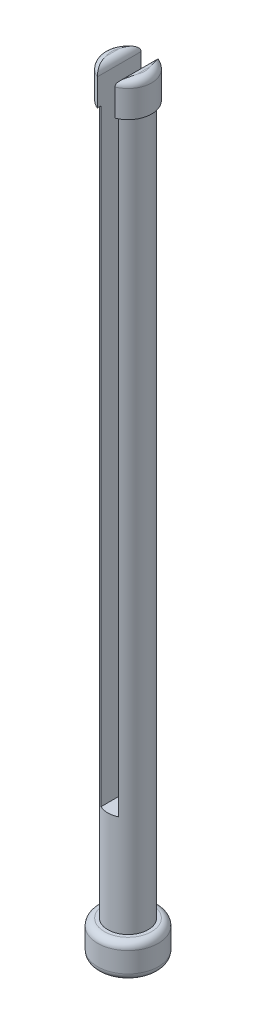
ISO-10303-21;
HEADER;
FILE_DESCRIPTION(('STEP AP214'),'2;1');
FILE_NAME('part.step','',(''),(''),'','','');
FILE_SCHEMA(('AUTOMOTIVE_DESIGN { 1 0 10303 214 1 1 1 1 }'));
ENDSEC;
DATA;
#1=APPLICATION_CONTEXT('core data for automotive mechanical design processes');
#2=APPLICATION_PROTOCOL_DEFINITION('international standard','automotive_design',2000,#1);
#3=PRODUCT_CONTEXT('',#1,'mechanical');
#4=PRODUCT('Part','Part','',(#3));
#5=PRODUCT_RELATED_PRODUCT_CATEGORY('part','',(#4));
#6=PRODUCT_DEFINITION_FORMATION('','',#4);
#7=PRODUCT_DEFINITION_CONTEXT('part definition',#1,'design');
#8=PRODUCT_DEFINITION('design','',#6,#7);
#9=PRODUCT_DEFINITION_SHAPE('','',#8);
#10=(LENGTH_UNIT() NAMED_UNIT(*) SI_UNIT(.MILLI.,.METRE.));
#11=(NAMED_UNIT(*) PLANE_ANGLE_UNIT() SI_UNIT($,.RADIAN.));
#12=(NAMED_UNIT(*) SI_UNIT($,.STERADIAN.) SOLID_ANGLE_UNIT());
#13=UNCERTAINTY_MEASURE_WITH_UNIT(LENGTH_MEASURE(1.E-05),#10,'distance_accuracy_value','');
#14=(GEOMETRIC_REPRESENTATION_CONTEXT(3) GLOBAL_UNCERTAINTY_ASSIGNED_CONTEXT((#13)) GLOBAL_UNIT_ASSIGNED_CONTEXT((#10,
#11,#12)) REPRESENTATION_CONTEXT('',''));
#15=CARTESIAN_POINT('',(0.,0.,0.));
#16=DIRECTION('',(0.,0.,1.));
#17=DIRECTION('',(1.,0.,0.));
#18=AXIS2_PLACEMENT_3D('',#15,#16,#17);
#19=CARTESIAN_POINT('',(0.,105.,0.));
#20=DIRECTION('',(0.,1.,0.));
#21=DIRECTION('',(0.,0.,1.));
#22=AXIS2_PLACEMENT_3D('',#19,#20,#21);
#23=CYLINDRICAL_SURFACE('',#22,3.5);
#24=DIRECTION('',(0.,1.,0.));
#25=VECTOR('',#24,1.);
#26=CARTESIAN_POINT('',(1.3,15.,-3.24961536185438));
#27=LINE('',#26,#25);
#28=CARTESIAN_POINT('',(1.3,105.,-3.24961536185438));
#29=VERTEX_POINT('',#28);
#30=CARTESIAN_POINT('',(1.3,109.,-3.24961536185438));
#31=VERTEX_POINT('',#30);
#32=EDGE_CURVE('E449',#29,#31,#27,.T.);
#33=ORIENTED_EDGE('',*,*,#32,.T.);
#34=CARTESIAN_POINT('',(0.,109.,0.));
#35=DIRECTION('',(0.,1.,0.));
#36=DIRECTION('',(0.,0.,1.));
#37=AXIS2_PLACEMENT_3D('',#34,#35,#36);
#38=CIRCLE('',#37,3.5);
#39=CARTESIAN_POINT('',(1.3,109.,3.24961536185438));
#40=VERTEX_POINT('',#39);
#41=EDGE_CURVE('E180',#31,#40,#38,.F.);
#42=ORIENTED_EDGE('',*,*,#41,.T.);
#43=DIRECTION('',(0.,1.,0.));
#44=VECTOR('',#43,1.);
#45=CARTESIAN_POINT('',(1.3,15.,3.24961536185438));
#46=LINE('',#45,#44);
#47=CARTESIAN_POINT('',(1.3,105.,3.24961536185438));
#48=VERTEX_POINT('',#47);
#49=EDGE_CURVE('E447',#48,#40,#46,.T.);
#50=ORIENTED_EDGE('',*,*,#49,.F.);
#51=CARTESIAN_POINT('',(0.,105.,0.));
#52=DIRECTION('',(0.,1.,0.));
#53=DIRECTION('',(0.,0.,1.));
#54=AXIS2_PLACEMENT_3D('',#51,#52,#53);
#55=CIRCLE('',#54,3.5);
#56=EDGE_CURVE('E144',#48,#29,#55,.T.);
#57=ORIENTED_EDGE('',*,*,#56,.T.);
#58=EDGE_LOOP('',(#33,#42,#50,#57));
#59=FACE_BOUND('',#58,.T.);
#60=ADVANCED_FACE('F39',(#59),#23,.T.);
#61=CARTESIAN_POINT('',(0.,105.,0.));
#62=DIRECTION('',(0.,1.,0.));
#63=DIRECTION('',(0.,0.,1.));
#64=AXIS2_PLACEMENT_3D('',#61,#62,#63);
#65=PLANE('',#64);
#66=ORIENTED_EDGE('',*,*,#56,.F.);
#67=DIRECTION('',(0.,0.,-1.));
#68=VECTOR('',#67,1.);
#69=CARTESIAN_POINT('',(1.3,105.,0.));
#70=LINE('',#69,#68);
#71=CARTESIAN_POINT('',(1.3,105.,2.70370116691916));
#72=VERTEX_POINT('',#71);
#73=EDGE_CURVE('E150',#48,#72,#70,.T.);
#74=ORIENTED_EDGE('',*,*,#73,.T.);
#75=CARTESIAN_POINT('',(0.,105.,0.));
#76=DIRECTION('',(0.,1.,0.));
#77=DIRECTION('',(0.,0.,1.));
#78=AXIS2_PLACEMENT_3D('',#75,#76,#77);
#79=CIRCLE('',#78,3.);
#80=CARTESIAN_POINT('',(1.3,105.,-2.70370116691916));
#81=VERTEX_POINT('',#80);
#82=EDGE_CURVE('E169',#72,#81,#79,.T.);
#83=ORIENTED_EDGE('',*,*,#82,.T.);
#84=EDGE_CURVE('E459',#81,#29,#70,.T.);
#85=ORIENTED_EDGE('',*,*,#84,.T.);
#86=EDGE_LOOP('',(#66,#74,#83,#85));
#87=FACE_BOUND('',#86,.T.);
#88=ADVANCED_FACE('F238',(#87),#65,.F.);
#89=CARTESIAN_POINT('',(0.,110.,0.));
#90=DIRECTION('',(0.,1.,0.));
#91=DIRECTION('',(0.,0.,1.));
#92=AXIS2_PLACEMENT_3D('',#89,#90,#91);
#93=PLANE('',#92);
#94=DIRECTION('',(0.,0.,-1.));
#95=VECTOR('',#94,1.);
#96=CARTESIAN_POINT('',(2.3,110.,3.24961536185438));
#97=LINE('',#96,#95);
#98=CARTESIAN_POINT('',(2.3,110.,-0.979795897113272));
#99=VERTEX_POINT('',#98);
#100=CARTESIAN_POINT('',(2.3,110.,0.979795897113272));
#101=VERTEX_POINT('',#100);
#102=EDGE_CURVE('E175',#99,#101,#97,.F.);
#103=ORIENTED_EDGE('',*,*,#102,.T.);
#104=CARTESIAN_POINT('',(0.,110.,0.));
#105=DIRECTION('',(0.,1.,0.));
#106=DIRECTION('',(0.,0.,1.));
#107=AXIS2_PLACEMENT_3D('',#104,#105,#106);
#108=CIRCLE('',#107,2.5);
#109=EDGE_CURVE('E177',#101,#99,#108,.T.);
#110=ORIENTED_EDGE('',*,*,#109,.T.);
#111=EDGE_LOOP('',(#103,#110));
#112=FACE_BOUND('',#111,.T.);
#113=ADVANCED_FACE('F229',(#112),#93,.T.);
#114=CARTESIAN_POINT('',(0.,110.,0.));
#115=DIRECTION('',(0.,-1.,0.));
#116=DIRECTION('',(0.,0.,-1.));
#117=AXIS2_PLACEMENT_3D('',#114,#115,#116);
#118=CYLINDRICAL_SURFACE('',#117,3.);
#119=CARTESIAN_POINT('',(0.,15.,0.));
#120=DIRECTION('',(0.,1.,0.));
#121=DIRECTION('',(0.,0.,1.));
#122=AXIS2_PLACEMENT_3D('',#119,#120,#121);
#123=CIRCLE('',#122,3.);
#124=CARTESIAN_POINT('',(1.3,15.,-2.70370116691916));
#125=VERTEX_POINT('',#124);
#126=CARTESIAN_POINT('',(-1.3,15.,-2.70370116691916));
#127=VERTEX_POINT('',#126);
#128=EDGE_CURVE('E174',#125,#127,#123,.T.);
#129=ORIENTED_EDGE('',*,*,#128,.F.);
#130=DIRECTION('',(0.,-1.,0.));
#131=VECTOR('',#130,1.);
#132=CARTESIAN_POINT('',(1.3,110.,-2.70370116691916));
#133=LINE('',#132,#131);
#134=EDGE_CURVE('E461',#125,#81,#133,.F.);
#135=ORIENTED_EDGE('',*,*,#134,.T.);
#136=ORIENTED_EDGE('',*,*,#82,.F.);
#137=DIRECTION('',(0.,-1.,0.));
#138=VECTOR('',#137,1.);
#139=CARTESIAN_POINT('',(1.3,110.,2.70370116691916));
#140=LINE('',#139,#138);
#141=CARTESIAN_POINT('',(1.3,15.,2.70370116691916));
#142=VERTEX_POINT('',#141);
#143=EDGE_CURVE('E145',#72,#142,#140,.T.);
#144=ORIENTED_EDGE('',*,*,#143,.T.);
#145=CARTESIAN_POINT('',(-1.3,15.,2.70370116691916));
#146=VERTEX_POINT('',#145);
#147=EDGE_CURVE('E172',#146,#142,#123,.T.);
#148=ORIENTED_EDGE('',*,*,#147,.F.);
#149=DIRECTION('',(0.,-1.,0.));
#150=VECTOR('',#149,1.);
#151=CARTESIAN_POINT('',(-1.3,110.,2.70370116691916));
#152=LINE('',#151,#150);
#153=CARTESIAN_POINT('',(-1.3,105.,2.70370116691916));
#154=VERTEX_POINT('',#153);
#155=EDGE_CURVE('E131',#146,#154,#152,.F.);
#156=ORIENTED_EDGE('',*,*,#155,.T.);
#157=CARTESIAN_POINT('',(-1.3,105.,-2.70370116691916));
#158=VERTEX_POINT('',#157);
#159=EDGE_CURVE('E168',#158,#154,#79,.T.);
#160=ORIENTED_EDGE('',*,*,#159,.F.);
#161=DIRECTION('',(0.,-1.,0.));
#162=VECTOR('',#161,1.);
#163=CARTESIAN_POINT('',(-1.3,110.,-2.70370116691916));
#164=LINE('',#163,#162);
#165=EDGE_CURVE('E126',#158,#127,#164,.T.);
#166=ORIENTED_EDGE('',*,*,#165,.T.);
#167=EDGE_LOOP('',(#129,#135,#136,#144,#148,#156,#160,#166));
#168=FACE_BOUND('',#167,.T.);
#169=CARTESIAN_POINT('',(0.,0.,0.));
#170=DIRECTION('',(0.,1.,0.));
#171=DIRECTION('',(0.,0.,1.));
#172=AXIS2_PLACEMENT_3D('',#169,#170,#171);
#173=CIRCLE('',#172,3.);
#174=CARTESIAN_POINT('',(0.,0.,3.));
#175=VERTEX_POINT('',#174);
#176=EDGE_CURVE('E148',#175,#175,#173,.T.);
#177=ORIENTED_EDGE('',*,*,#176,.T.);
#178=EDGE_LOOP('',(#177));
#179=FACE_BOUND('',#178,.T.);
#180=ADVANCED_FACE('F242',(#168,#179),#118,.T.);
#181=CARTESIAN_POINT('',(0.,-5.,0.));
#182=DIRECTION('',(0.,1.,0.));
#183=DIRECTION('',(0.,0.,1.));
#184=AXIS2_PLACEMENT_3D('',#181,#182,#183);
#185=CYLINDRICAL_SURFACE('',#184,4.5);
#186=CARTESIAN_POINT('',(0.,-1.,0.));
#187=DIRECTION('',(0.,-1.,0.));
#188=DIRECTION('',(0.,0.,-1.));
#189=AXIS2_PLACEMENT_3D('',#186,#187,#188);
#190=CIRCLE('',#189,4.5);
#191=CARTESIAN_POINT('',(0.,-1.,-4.5));
#192=VERTEX_POINT('',#191);
#193=EDGE_CURVE('E159',#192,#192,#190,.T.);
#194=ORIENTED_EDGE('',*,*,#193,.T.);
#195=EDGE_LOOP('',(#194));
#196=FACE_BOUND('',#195,.T.);
#197=CARTESIAN_POINT('',(0.,-4.,0.));
#198=DIRECTION('',(0.,-1.,0.));
#199=DIRECTION('',(0.,0.,-1.));
#200=AXIS2_PLACEMENT_3D('',#197,#198,#199);
#201=CIRCLE('',#200,4.5);
#202=CARTESIAN_POINT('',(0.,-4.,-4.5));
#203=VERTEX_POINT('',#202);
#204=EDGE_CURVE('E156',#203,#203,#201,.F.);
#205=ORIENTED_EDGE('',*,*,#204,.T.);
#206=EDGE_LOOP('',(#205));
#207=FACE_BOUND('',#206,.T.);
#208=ADVANCED_FACE('F269',(#196,#207),#185,.T.);
#209=CARTESIAN_POINT('',(0.,-5.,0.));
#210=DIRECTION('',(0.,-1.,0.));
#211=DIRECTION('',(0.,0.,-1.));
#212=AXIS2_PLACEMENT_3D('',#209,#210,#211);
#213=PLANE('',#212);
#214=CARTESIAN_POINT('',(0.,-5.,0.));
#215=DIRECTION('',(0.,-1.,0.));
#216=DIRECTION('',(0.,0.,-1.));
#217=AXIS2_PLACEMENT_3D('',#214,#215,#216);
#218=CIRCLE('',#217,3.5);
#219=CARTESIAN_POINT('',(0.,-5.,-3.5));
#220=VERTEX_POINT('',#219);
#221=EDGE_CURVE('E165',#220,#220,#218,.T.);
#222=ORIENTED_EDGE('',*,*,#221,.T.);
#223=EDGE_LOOP('',(#222));
#224=FACE_BOUND('',#223,.T.);
#225=ADVANCED_FACE('F274',(#224),#213,.T.);
#226=CARTESIAN_POINT('',(0.,0.,0.));
#227=DIRECTION('',(0.,-1.,0.));
#228=DIRECTION('',(0.,0.,-1.));
#229=AXIS2_PLACEMENT_3D('',#226,#227,#228);
#230=PLANE('',#229);
#231=CARTESIAN_POINT('',(0.,0.,0.));
#232=DIRECTION('',(0.,-1.,0.));
#233=DIRECTION('',(0.,0.,-1.));
#234=AXIS2_PLACEMENT_3D('',#231,#232,#233);
#235=CIRCLE('',#234,3.5);
#236=CARTESIAN_POINT('',(0.,0.,-3.5));
#237=VERTEX_POINT('',#236);
#238=EDGE_CURVE('E162',#237,#237,#235,.F.);
#239=ORIENTED_EDGE('',*,*,#238,.T.);
#240=EDGE_LOOP('',(#239));
#241=FACE_BOUND('',#240,.T.);
#242=ORIENTED_EDGE('',*,*,#176,.F.);
#243=EDGE_LOOP('',(#242));
#244=FACE_BOUND('',#243,.T.);
#245=ADVANCED_FACE('F263',(#241,#244),#230,.F.);
#246=CARTESIAN_POINT('',(0.,-1.,0.));
#247=DIRECTION('',(0.,-1.,0.));
#248=DIRECTION('',(0.,0.,-1.));
#249=AXIS2_PLACEMENT_3D('',#246,#247,#248);
#250=TOROIDAL_SURFACE('',#249,3.5,1.);
#251=ORIENTED_EDGE('',*,*,#238,.F.);
#252=EDGE_LOOP('',(#251));
#253=FACE_BOUND('',#252,.T.);
#254=ORIENTED_EDGE('',*,*,#193,.F.);
#255=EDGE_LOOP('',(#254));
#256=FACE_BOUND('',#255,.T.);
#257=ADVANCED_FACE('F258',(#253,#256),#250,.T.);
#258=CARTESIAN_POINT('',(0.,-4.,0.));
#259=DIRECTION('',(0.,-1.,0.));
#260=DIRECTION('',(0.,0.,-1.));
#261=AXIS2_PLACEMENT_3D('',#258,#259,#260);
#262=TOROIDAL_SURFACE('',#261,3.5,1.);
#263=ORIENTED_EDGE('',*,*,#204,.F.);
#264=EDGE_LOOP('',(#263));
#265=FACE_BOUND('',#264,.T.);
#266=ORIENTED_EDGE('',*,*,#221,.F.);
#267=EDGE_LOOP('',(#266));
#268=FACE_BOUND('',#267,.T.);
#269=ADVANCED_FACE('F254',(#265,#268),#262,.T.);
#270=DIRECTION('',(0.,1.,0.));
#271=VECTOR('',#270,1.);
#272=CARTESIAN_POINT('',(-1.3,15.,3.24961536185438));
#273=LINE('',#272,#271);
#274=CARTESIAN_POINT('',(-1.3,105.,3.24961536185438));
#275=VERTEX_POINT('',#274);
#276=CARTESIAN_POINT('',(-1.3,109.,3.24961536185438));
#277=VERTEX_POINT('',#276);
#278=EDGE_CURVE('E139',#275,#277,#273,.T.);
#279=ORIENTED_EDGE('',*,*,#278,.T.);
#280=CARTESIAN_POINT('',(0.,109.,0.));
#281=DIRECTION('',(0.,1.,0.));
#282=DIRECTION('',(0.,0.,1.));
#283=AXIS2_PLACEMENT_3D('',#280,#281,#282);
#284=CIRCLE('',#283,3.5);
#285=CARTESIAN_POINT('',(-1.3,109.,-3.24961536185439));
#286=VERTEX_POINT('',#285);
#287=EDGE_CURVE('E53',#277,#286,#284,.F.);
#288=ORIENTED_EDGE('',*,*,#287,.T.);
#289=DIRECTION('',(0.,1.,0.));
#290=VECTOR('',#289,1.);
#291=CARTESIAN_POINT('',(-1.3,15.,-3.24961536185439));
#292=LINE('',#291,#290);
#293=CARTESIAN_POINT('',(-1.3,105.,-3.24961536185439));
#294=VERTEX_POINT('',#293);
#295=EDGE_CURVE('E123',#294,#286,#292,.T.);
#296=ORIENTED_EDGE('',*,*,#295,.F.);
#297=EDGE_CURVE('E138',#294,#275,#55,.T.);
#298=ORIENTED_EDGE('',*,*,#297,.T.);
#299=EDGE_LOOP('',(#279,#288,#296,#298));
#300=FACE_BOUND('',#299,.T.);
#301=ADVANCED_FACE('F137',(#300),#23,.T.);
#302=ORIENTED_EDGE('',*,*,#297,.F.);
#303=DIRECTION('',(0.,0.,1.));
#304=VECTOR('',#303,1.);
#305=CARTESIAN_POINT('',(-1.3,105.,0.));
#306=LINE('',#305,#304);
#307=EDGE_CURVE('E120',#294,#158,#306,.T.);
#308=ORIENTED_EDGE('',*,*,#307,.T.);
#309=ORIENTED_EDGE('',*,*,#159,.T.);
#310=EDGE_CURVE('E133',#154,#275,#306,.T.);
#311=ORIENTED_EDGE('',*,*,#310,.T.);
#312=EDGE_LOOP('',(#302,#308,#309,#311));
#313=FACE_BOUND('',#312,.T.);
#314=ADVANCED_FACE('F143',(#313),#65,.F.);
#315=DIRECTION('',(0.,0.,1.));
#316=VECTOR('',#315,1.);
#317=CARTESIAN_POINT('',(-2.3,110.,-3.24961536185439));
#318=LINE('',#317,#316);
#319=CARTESIAN_POINT('',(-2.3,110.,0.979795897113274));
#320=VERTEX_POINT('',#319);
#321=CARTESIAN_POINT('',(-2.3,110.,-0.979795897113274));
#322=VERTEX_POINT('',#321);
#323=EDGE_CURVE('E185',#320,#322,#318,.F.);
#324=ORIENTED_EDGE('',*,*,#323,.T.);
#325=CARTESIAN_POINT('',(0.,110.,0.));
#326=DIRECTION('',(0.,1.,0.));
#327=DIRECTION('',(0.,0.,1.));
#328=AXIS2_PLACEMENT_3D('',#325,#326,#327);
#329=CIRCLE('',#328,2.5);
#330=EDGE_CURVE('E187',#322,#320,#329,.T.);
#331=ORIENTED_EDGE('',*,*,#330,.T.);
#332=EDGE_LOOP('',(#324,#331));
#333=FACE_BOUND('',#332,.T.);
#334=ADVANCED_FACE('F225',(#333),#93,.T.);
#335=CARTESIAN_POINT('',(0.,15.,0.));
#336=DIRECTION('',(0.,1.,0.));
#337=DIRECTION('',(0.,0.,1.));
#338=AXIS2_PLACEMENT_3D('',#335,#336,#337);
#339=PLANE('',#338);
#340=ORIENTED_EDGE('',*,*,#128,.T.);
#341=DIRECTION('',(0.,0.,1.));
#342=VECTOR('',#341,1.);
#343=CARTESIAN_POINT('',(-1.3,15.,-3.24961536185439));
#344=LINE('',#343,#342);
#345=EDGE_CURVE('E444',#127,#146,#344,.T.);
#346=ORIENTED_EDGE('',*,*,#345,.T.);
#347=ORIENTED_EDGE('',*,*,#147,.T.);
#348=DIRECTION('',(0.,0.,-1.));
#349=VECTOR('',#348,1.);
#350=CARTESIAN_POINT('',(1.3,15.,-3.24961536185438));
#351=LINE('',#350,#349);
#352=EDGE_CURVE('E140',#142,#125,#351,.T.);
#353=ORIENTED_EDGE('',*,*,#352,.T.);
#354=EDGE_LOOP('',(#340,#346,#347,#353));
#355=FACE_BOUND('',#354,.T.);
#356=ADVANCED_FACE('F227',(#355),#339,.T.);
#357=CARTESIAN_POINT('',(1.3,15.,-3.24961536185438));
#358=DIRECTION('',(1.,0.,0.));
#359=DIRECTION('',(0.,0.,-1.));
#360=AXIS2_PLACEMENT_3D('',#357,#358,#359);
#361=PLANE('',#360);
#362=ORIENTED_EDGE('',*,*,#49,.T.);
#363=DIRECTION('',(0.,0.,-1.));
#364=VECTOR('',#363,1.);
#365=CARTESIAN_POINT('',(1.3,109.,-3.24961536185438));
#366=LINE('',#365,#364);
#367=EDGE_CURVE('E183',#40,#31,#366,.T.);
#368=ORIENTED_EDGE('',*,*,#367,.T.);
#369=ORIENTED_EDGE('',*,*,#32,.F.);
#370=ORIENTED_EDGE('',*,*,#84,.F.);
#371=ORIENTED_EDGE('',*,*,#134,.F.);
#372=ORIENTED_EDGE('',*,*,#352,.F.);
#373=ORIENTED_EDGE('',*,*,#143,.F.);
#374=ORIENTED_EDGE('',*,*,#73,.F.);
#375=EDGE_LOOP('',(#362,#368,#369,#370,#371,#372,#373,#374));
#376=FACE_BOUND('',#375,.T.);
#377=ADVANCED_FACE('F234',(#376),#361,.F.);
#378=CARTESIAN_POINT('',(-1.3,15.,-3.24961536185439));
#379=DIRECTION('',(-1.,0.,0.));
#380=DIRECTION('',(0.,0.,1.));
#381=AXIS2_PLACEMENT_3D('',#378,#379,#380);
#382=PLANE('',#381);
#383=ORIENTED_EDGE('',*,*,#295,.T.);
#384=DIRECTION('',(0.,0.,1.));
#385=VECTOR('',#384,1.);
#386=CARTESIAN_POINT('',(-1.3,109.,3.24961536185439));
#387=LINE('',#386,#385);
#388=EDGE_CURVE('E11',#286,#277,#387,.T.);
#389=ORIENTED_EDGE('',*,*,#388,.T.);
#390=ORIENTED_EDGE('',*,*,#278,.F.);
#391=ORIENTED_EDGE('',*,*,#310,.F.);
#392=ORIENTED_EDGE('',*,*,#155,.F.);
#393=ORIENTED_EDGE('',*,*,#345,.F.);
#394=ORIENTED_EDGE('',*,*,#165,.F.);
#395=ORIENTED_EDGE('',*,*,#307,.F.);
#396=EDGE_LOOP('',(#383,#389,#390,#391,#392,#393,#394,#395));
#397=FACE_BOUND('',#396,.T.);
#398=ADVANCED_FACE('F122',(#397),#382,.F.);
#399=CARTESIAN_POINT('',(2.3,109.,-3.24961536185438));
#400=DIRECTION('',(0.,0.,1.));
#401=DIRECTION('',(1.,0.,0.));
#402=AXIS2_PLACEMENT_3D('',#399,#400,#401);
#403=CYLINDRICAL_SURFACE('',#402,1.);
#404=CARTESIAN_POINT('',(1.3,109.,-3.24961536185438));
#405=CARTESIAN_POINT('',(1.29999617948563,109.019474030543,-3.24961990449372));
#406=CARTESIAN_POINT('',(1.30056944602511,109.038933366426,-3.24877431368444));
#407=CARTESIAN_POINT('',(1.30282966735056,109.077620927511,-3.24543364635595));
#408=CARTESIAN_POINT('',(1.30451523516631,109.096849410208,-3.24294062407548));
#409=CARTESIAN_POINT('',(1.31112402450608,109.153462817199,-3.23314907909252));
#410=CARTESIAN_POINT('',(1.31760166750374,109.190292415144,-3.22353506439727));
#411=CARTESIAN_POINT('',(1.33399254225991,109.261055386044,-3.19903383034988));
#412=CARTESIAN_POINT('',(1.34389013109467,109.295001084083,-3.18417061426155));
#413=CARTESIAN_POINT('',(1.36634102424429,109.359807077856,-3.15014559392438));
#414=CARTESIAN_POINT('',(1.37890288410622,109.390656950459,-3.13096992920808));
#415=CARTESIAN_POINT('',(1.41284404887768,109.46403335045,-3.07858458464715));
#416=CARTESIAN_POINT('',(1.43544332136667,109.504443601009,-3.04321841822527));
#417=CARTESIAN_POINT('',(1.48300255301403,109.578319414985,-2.9672590370184));
#418=CARTESIAN_POINT('',(1.50796734543838,109.611770293306,-2.92665505633897));
#419=CARTESIAN_POINT('',(1.55488616865933,109.667769359681,-2.84857283552067));
#420=CARTESIAN_POINT('',(1.57668669227106,109.691205460478,-2.81162626283582));
#421=CARTESIAN_POINT('',(1.62053682228423,109.734353422963,-2.73574325182172));
#422=CARTESIAN_POINT('',(1.64258659507063,109.754062619566,-2.69680541464126));
#423=CARTESIAN_POINT('',(1.70858713467808,109.808391620741,-2.5775686666515));
#424=CARTESIAN_POINT('',(1.75233561914954,109.838153794094,-2.49493454337694));
#425=CARTESIAN_POINT('',(1.82751169009361,109.882143907925,-2.34524057375441));
#426=CARTESIAN_POINT('',(1.85945489940552,109.898371211877,-2.2789811599933));
#427=CARTESIAN_POINT('',(1.92139303097132,109.926180757283,-2.14456037907195));
#428=CARTESIAN_POINT('',(1.95138696558684,109.937760659183,-2.07639807239368));
#429=CARTESIAN_POINT('',(2.00900690731399,109.957207415398,-1.93862840785605));
#430=CARTESIAN_POINT('',(2.03663430576567,109.965076463841,-1.86902192938078));
#431=CARTESIAN_POINT('',(2.08927165832763,109.977919893623,-1.72856135606967));
#432=CARTESIAN_POINT('',(2.11428134212099,109.982893976257,-1.65770713326702));
#433=CARTESIAN_POINT('',(2.15970085002571,109.990356044282,-1.52027494743875));
#434=CARTESIAN_POINT('',(2.18031466231242,109.993001854237,-1.45377244678355));
#435=CARTESIAN_POINT('',(2.21895634053019,109.996899618255,-1.32003301967953));
#436=CARTESIAN_POINT('',(2.23698606086279,109.998152576268,-1.2527966575336));
#437=CARTESIAN_POINT('',(2.26713300711006,109.999550451322,-1.13070583976032));
#438=CARTESIAN_POINT('',(2.27971954650943,109.999862672938,-1.0759688644992));
#439=CARTESIAN_POINT('',(2.29362479118003,109.999982132452,-1.01059938309482));
#440=CARTESIAN_POINT('',(2.29581362632801,109.999993558662,-1.00014926122411));
#441=CARTESIAN_POINT('',(2.29864972179388,109.99999932047,-0.986394213879184));
#442=CARTESIAN_POINT('',(2.29932649304671,110.000000001092,-0.98309539161348));
#443=CARTESIAN_POINT('',(2.3,110.,-0.979795897113272));
#444=B_SPLINE_CURVE_WITH_KNOTS('',3,(#404,#405,#406,#407,#408,#409,#410,#411,#412,#413,#414,
#415,#416,#417,#418,#419,#420,#421,#422,#423,#424,#425,#426,#427,#428,#429,#430,#431,#432,#433,
#434,#435,#436,#437,#438,#439,#440,#441,#442,#443),.UNSPECIFIED.,.F.,.F.,(4,2,2,2,2,2,2,2,2,2,2,
2,2,2,2,2,2,2,2,4),(0.,0.0583680824632132,0.1166635207535,0.231732977880348,0.346282923008827,
0.461206438101285,0.635014714293363,0.809186107646312,0.955626002674397,1.10217022313356,
1.39561102764091,1.62141461550488,1.84733173332468,2.07311510445687,2.29892176803411,
2.50787765095711,2.71668282354583,2.88514708070452,2.9171776894304,2.92728027210927),.UNSPECIFIED.);
#445=EDGE_CURVE('E191',#31,#99,#444,.T.);
#446=ORIENTED_EDGE('',*,*,#445,.F.);
#447=ORIENTED_EDGE('',*,*,#367,.F.);
#448=CARTESIAN_POINT('',(1.3,109.,3.24961536185438));
#449=CARTESIAN_POINT('',(1.29999617948563,109.019474030543,3.24961990449372));
#450=CARTESIAN_POINT('',(1.30056944602511,109.038933366426,3.24877431368444));
#451=CARTESIAN_POINT('',(1.30282966735056,109.077620927511,3.24543364635595));
#452=CARTESIAN_POINT('',(1.30451523516631,109.096849410208,3.24294062407548));
#453=CARTESIAN_POINT('',(1.31112402450608,109.153462817199,3.23314907909252));
#454=CARTESIAN_POINT('',(1.31760166750374,109.190292415144,3.22353506439727));
#455=CARTESIAN_POINT('',(1.33399254225991,109.261055386044,3.19903383034988));
#456=CARTESIAN_POINT('',(1.34389013109467,109.295001084083,3.18417061426155));
#457=CARTESIAN_POINT('',(1.36634102424429,109.359807077856,3.15014559392438));
#458=CARTESIAN_POINT('',(1.37890288410622,109.390656950459,3.13096992920808));
#459=CARTESIAN_POINT('',(1.41284404887768,109.46403335045,3.07858458464715));
#460=CARTESIAN_POINT('',(1.43544332136667,109.504443601009,3.04321841822527));
#461=CARTESIAN_POINT('',(1.48300255301403,109.578319414985,2.9672590370184));
#462=CARTESIAN_POINT('',(1.50796734543838,109.611770293306,2.92665505633897));
#463=CARTESIAN_POINT('',(1.55488616865933,109.667769359681,2.84857283552067));
#464=CARTESIAN_POINT('',(1.57668669227106,109.691205460478,2.81162626283582));
#465=CARTESIAN_POINT('',(1.62053682228423,109.734353422963,2.73574325182172));
#466=CARTESIAN_POINT('',(1.64258659507063,109.754062619566,2.69680541464126));
#467=CARTESIAN_POINT('',(1.70858713467808,109.808391620741,2.5775686666515));
#468=CARTESIAN_POINT('',(1.75233561914954,109.838153794094,2.49493454337694));
#469=CARTESIAN_POINT('',(1.82751169009361,109.882143907925,2.34524057375441));
#470=CARTESIAN_POINT('',(1.85945489940552,109.898371211877,2.2789811599933));
#471=CARTESIAN_POINT('',(1.92139303097132,109.926180757283,2.14456037907195));
#472=CARTESIAN_POINT('',(1.95138696558684,109.937760659183,2.07639807239368));
#473=CARTESIAN_POINT('',(2.00900690731399,109.957207415398,1.93862840785605));
#474=CARTESIAN_POINT('',(2.03663430576567,109.965076463841,1.86902192938078));
#475=CARTESIAN_POINT('',(2.08927165832763,109.977919893623,1.72856135606967));
#476=CARTESIAN_POINT('',(2.11428134212099,109.982893976257,1.65770713326702));
#477=CARTESIAN_POINT('',(2.15970085002571,109.990356044282,1.52027494743875));
#478=CARTESIAN_POINT('',(2.18031466231242,109.993001854237,1.45377244678355));
#479=CARTESIAN_POINT('',(2.21895634053019,109.996899618255,1.32003301967953));
#480=CARTESIAN_POINT('',(2.23698606086279,109.998152576268,1.2527966575336));
#481=CARTESIAN_POINT('',(2.26713300711006,109.999550451322,1.13070583976032));
#482=CARTESIAN_POINT('',(2.27971954650943,109.999862672938,1.0759688644992));
#483=CARTESIAN_POINT('',(2.29362479118003,109.999982132452,1.01059938309482));
#484=CARTESIAN_POINT('',(2.29581362632801,109.999993558662,1.00014926122411));
#485=CARTESIAN_POINT('',(2.29864972179388,109.99999932047,0.986394213879184));
#486=CARTESIAN_POINT('',(2.29932649304671,110.000000001092,0.98309539161348));
#487=CARTESIAN_POINT('',(2.3,110.,0.979795897113272));
#488=B_SPLINE_CURVE_WITH_KNOTS('',3,(#448,#449,#450,#451,#452,#453,#454,#455,#456,#457,#458,
#459,#460,#461,#462,#463,#464,#465,#466,#467,#468,#469,#470,#471,#472,#473,#474,#475,#476,#477,
#478,#479,#480,#481,#482,#483,#484,#485,#486,#487),.UNSPECIFIED.,.F.,.F.,(4,2,2,2,2,2,2,2,2,2,2,
2,2,2,2,2,2,2,2,4),(0.,0.0583680824632132,0.1166635207535,0.231732977880348,0.346282923008827,
0.461206438101285,0.635014714293363,0.809186107646312,0.955626002674397,1.10217022313356,
1.39561102764091,1.62141461550488,1.84733173332468,2.07311510445687,2.29892176803411,
2.50787765095711,2.71668282354583,2.88514708070452,2.9171776894304,2.92728027210927),.UNSPECIFIED.);
#489=EDGE_CURVE('E199',#101,#40,#488,.F.);
#490=ORIENTED_EDGE('',*,*,#489,.F.);
#491=ORIENTED_EDGE('',*,*,#102,.F.);
#492=EDGE_LOOP('',(#446,#447,#490,#491));
#493=FACE_BOUND('',#492,.T.);
#494=ADVANCED_FACE('F207',(#493),#403,.T.);
#495=CARTESIAN_POINT('',(0.,109.,0.));
#496=DIRECTION('',(0.,1.,0.));
#497=DIRECTION('',(0.,0.,1.));
#498=AXIS2_PLACEMENT_3D('',#495,#496,#497);
#499=TOROIDAL_SURFACE('',#498,2.5,1.);
#500=ORIENTED_EDGE('',*,*,#489,.T.);
#501=ORIENTED_EDGE('',*,*,#41,.F.);
#502=ORIENTED_EDGE('',*,*,#445,.T.);
#503=ORIENTED_EDGE('',*,*,#109,.F.);
#504=EDGE_LOOP('',(#500,#501,#502,#503));
#505=FACE_BOUND('',#504,.T.);
#506=ADVANCED_FACE('F204',(#505),#499,.T.);
#507=CARTESIAN_POINT('',(-2.3,109.,-3.24961536185439));
#508=DIRECTION('',(0.,0.,-1.));
#509=DIRECTION('',(-1.,0.,0.));
#510=AXIS2_PLACEMENT_3D('',#507,#508,#509);
#511=CYLINDRICAL_SURFACE('',#510,1.);
#512=CARTESIAN_POINT('',(-1.3,109.,3.24961536185438));
#513=CARTESIAN_POINT('',(-1.29999617948563,109.019474030543,3.24961990449372));
#514=CARTESIAN_POINT('',(-1.30056944602511,109.038933366426,3.24877431368444));
#515=CARTESIAN_POINT('',(-1.30282966735056,109.077620927511,3.24543364635595));
#516=CARTESIAN_POINT('',(-1.30451523516631,109.096849410208,3.24294062407548));
#517=CARTESIAN_POINT('',(-1.31112402450608,109.153462817199,3.23314907909252));
#518=CARTESIAN_POINT('',(-1.31760166750374,109.190292415144,3.22353506439727));
#519=CARTESIAN_POINT('',(-1.33399254225991,109.261055386044,3.19903383034988));
#520=CARTESIAN_POINT('',(-1.34389013109467,109.295001084083,3.18417061426155));
#521=CARTESIAN_POINT('',(-1.36634102424429,109.359807077856,3.15014559392438));
#522=CARTESIAN_POINT('',(-1.37890288410622,109.390656950459,3.13096992920808));
#523=CARTESIAN_POINT('',(-1.41284404887768,109.46403335045,3.07858458464715));
#524=CARTESIAN_POINT('',(-1.43544332136667,109.504443601009,3.04321841822527));
#525=CARTESIAN_POINT('',(-1.48300255301403,109.578319414985,2.9672590370184));
#526=CARTESIAN_POINT('',(-1.50796734543838,109.611770293306,2.92665505633897));
#527=CARTESIAN_POINT('',(-1.55488616865932,109.667769359681,2.84857283552067));
#528=CARTESIAN_POINT('',(-1.57668669227106,109.691205460478,2.81162626283582));
#529=CARTESIAN_POINT('',(-1.62053682228423,109.734353422963,2.73574325182172));
#530=CARTESIAN_POINT('',(-1.64258659507063,109.754062619566,2.69680541464126));
#531=CARTESIAN_POINT('',(-1.70858713467808,109.808391620741,2.5775686666515));
#532=CARTESIAN_POINT('',(-1.75233561914953,109.838153794094,2.49493454337694));
#533=CARTESIAN_POINT('',(-1.82751169009361,109.882143907925,2.34524057375442));
#534=CARTESIAN_POINT('',(-1.85945489940552,109.898371211877,2.2789811599933));
#535=CARTESIAN_POINT('',(-1.92139303097132,109.926180757283,2.14456037907196));
#536=CARTESIAN_POINT('',(-1.95138696558684,109.937760659183,2.07639807239368));
#537=CARTESIAN_POINT('',(-2.00900690731399,109.957207415398,1.93862840785605));
#538=CARTESIAN_POINT('',(-2.03663430576567,109.965076463841,1.86902192938078));
#539=CARTESIAN_POINT('',(-2.08927165832763,109.977919893623,1.72856135606967));
#540=CARTESIAN_POINT('',(-2.11428134212099,109.982893976257,1.65770713326702));
#541=CARTESIAN_POINT('',(-2.15970085002571,109.990356044282,1.52027494743875));
#542=CARTESIAN_POINT('',(-2.18031466231242,109.993001854237,1.45377244678356));
#543=CARTESIAN_POINT('',(-2.21895634053019,109.996899618255,1.32003301967953));
#544=CARTESIAN_POINT('',(-2.23698606086279,109.998152576268,1.2527966575336));
#545=CARTESIAN_POINT('',(-2.26713300711006,109.999550451322,1.13070583976032));
#546=CARTESIAN_POINT('',(-2.27971954650943,109.999862672938,1.0759688644992));
#547=CARTESIAN_POINT('',(-2.29362479118003,109.999982132452,1.01059938309482));
#548=CARTESIAN_POINT('',(-2.29581362632801,109.999993558662,1.00014926122411));
#549=CARTESIAN_POINT('',(-2.29864972179388,109.99999932047,0.986394213879186));
#550=CARTESIAN_POINT('',(-2.29932649304671,110.000000001092,0.983095391613482));
#551=CARTESIAN_POINT('',(-2.3,110.,0.979795897113274));
#552=B_SPLINE_CURVE_WITH_KNOTS('',3,(#512,#513,#514,#515,#516,#517,#518,#519,#520,#521,#522,
#523,#524,#525,#526,#527,#528,#529,#530,#531,#532,#533,#534,#535,#536,#537,#538,#539,#540,#541,
#542,#543,#544,#545,#546,#547,#548,#549,#550,#551),.UNSPECIFIED.,.F.,.F.,(4,2,2,2,2,2,2,2,2,2,2,
2,2,2,2,2,2,2,2,4),(0.,0.0583680824632131,0.116663520753515,0.231732977880348,0.346282923008827,
0.461206438101285,0.635014714293363,0.809186107646312,0.955626002674397,1.10217022313356,
1.3956110276409,1.62141461550488,1.84733173332468,2.07311510445687,2.29892176803411,
2.50787765095711,2.71668282354583,2.88514708070452,2.9171776894304,2.92728027210927),.UNSPECIFIED.);
#553=EDGE_CURVE('E216',#277,#320,#552,.T.);
#554=ORIENTED_EDGE('',*,*,#553,.F.);
#555=ORIENTED_EDGE('',*,*,#388,.F.);
#556=CARTESIAN_POINT('',(-1.3,109.,-3.24961536185439));
#557=CARTESIAN_POINT('',(-1.29999617948563,109.019474030543,-3.24961990449372));
#558=CARTESIAN_POINT('',(-1.30056944602511,109.038933366426,-3.24877431368444));
#559=CARTESIAN_POINT('',(-1.30282966735056,109.077620927511,-3.24543364635595));
#560=CARTESIAN_POINT('',(-1.30451523516631,109.096849410208,-3.24294062407548));
#561=CARTESIAN_POINT('',(-1.31112402450608,109.153462817199,-3.23314907909252));
#562=CARTESIAN_POINT('',(-1.31760166750374,109.190292415144,-3.22353506439727));
#563=CARTESIAN_POINT('',(-1.33399254225991,109.261055386044,-3.19903383034988));
#564=CARTESIAN_POINT('',(-1.34389013109467,109.295001084083,-3.18417061426155));
#565=CARTESIAN_POINT('',(-1.36634102424428,109.359807077856,-3.15014559392438));
#566=CARTESIAN_POINT('',(-1.37890288410622,109.390656950459,-3.13096992920808));
#567=CARTESIAN_POINT('',(-1.41284404887768,109.46403335045,-3.07858458464715));
#568=CARTESIAN_POINT('',(-1.43544332136666,109.504443601009,-3.04321841822527));
#569=CARTESIAN_POINT('',(-1.48300255301403,109.578319414985,-2.96725903701841));
#570=CARTESIAN_POINT('',(-1.50796734543838,109.611770293306,-2.92665505633898));
#571=CARTESIAN_POINT('',(-1.55488616865933,109.667769359681,-2.84857283552067));
#572=CARTESIAN_POINT('',(-1.57668669227106,109.691205460478,-2.81162626283582));
#573=CARTESIAN_POINT('',(-1.62053682228423,109.734353422963,-2.73574325182172));
#574=CARTESIAN_POINT('',(-1.64258659507063,109.754062619566,-2.69680541464126));
#575=CARTESIAN_POINT('',(-1.70858713467808,109.808391620741,-2.5775686666515));
#576=CARTESIAN_POINT('',(-1.75233561914953,109.838153794094,-2.49493454337694));
#577=CARTESIAN_POINT('',(-1.82751169009361,109.882143907925,-2.34524057375442));
#578=CARTESIAN_POINT('',(-1.85945489940552,109.898371211877,-2.2789811599933));
#579=CARTESIAN_POINT('',(-1.92139303097132,109.926180757283,-2.14456037907196));
#580=CARTESIAN_POINT('',(-1.95138696558684,109.937760659183,-2.07639807239368));
#581=CARTESIAN_POINT('',(-2.00900690731399,109.957207415398,-1.93862840785605));
#582=CARTESIAN_POINT('',(-2.03663430576567,109.965076463841,-1.86902192938078));
#583=CARTESIAN_POINT('',(-2.08927165832763,109.977919893623,-1.72856135606967));
#584=CARTESIAN_POINT('',(-2.11428134212099,109.982893976257,-1.65770713326702));
#585=CARTESIAN_POINT('',(-2.15970085002571,109.990356044282,-1.52027494743875));
#586=CARTESIAN_POINT('',(-2.18031466231242,109.993001854237,-1.45377244678356));
#587=CARTESIAN_POINT('',(-2.21895634053019,109.996899618255,-1.32003301967953));
#588=CARTESIAN_POINT('',(-2.23698606086278,109.998152576268,-1.2527966575336));
#589=CARTESIAN_POINT('',(-2.26713300711006,109.999550451322,-1.13070583976032));
#590=CARTESIAN_POINT('',(-2.27971954650944,109.999862672938,-1.0759688644992));
#591=CARTESIAN_POINT('',(-2.29362479118002,109.999982132452,-1.01059938309482));
#592=CARTESIAN_POINT('',(-2.295813626328,109.999993558662,-1.00014926122411));
#593=CARTESIAN_POINT('',(-2.29864972179388,109.99999932047,-0.986394213879185));
#594=CARTESIAN_POINT('',(-2.29932649304671,110.000000001092,-0.983095391613481));
#595=CARTESIAN_POINT('',(-2.3,110.,-0.979795897113274));
#596=B_SPLINE_CURVE_WITH_KNOTS('',3,(#556,#557,#558,#559,#560,#561,#562,#563,#564,#565,#566,
#567,#568,#569,#570,#571,#572,#573,#574,#575,#576,#577,#578,#579,#580,#581,#582,#583,#584,#585,
#586,#587,#588,#589,#590,#591,#592,#593,#594,#595),.UNSPECIFIED.,.F.,.F.,(4,2,2,2,2,2,2,2,2,2,2,
2,2,2,2,2,2,2,2,4),(0.,0.0583680824632132,0.1166635207535,0.231732977880348,0.346282923008811,
0.461206438101285,0.635014714293346,0.809186107646311,0.955626002674405,1.10217022313356,
1.3956110276409,1.62141461550488,1.84733173332467,2.07311510445687,2.29892176803411,
2.50787765095711,2.71668282354583,2.88514708070452,2.9171776894304,2.92728027210926),.UNSPECIFIED.);
#597=EDGE_CURVE('E44',#322,#286,#596,.F.);
#598=ORIENTED_EDGE('',*,*,#597,.F.);
#599=ORIENTED_EDGE('',*,*,#323,.F.);
#600=EDGE_LOOP('',(#554,#555,#598,#599));
#601=FACE_BOUND('',#600,.T.);
#602=ADVANCED_FACE('F41',(#601),#511,.T.);
#603=CARTESIAN_POINT('',(0.,109.,0.));
#604=DIRECTION('',(0.,1.,0.));
#605=DIRECTION('',(0.,0.,1.));
#606=AXIS2_PLACEMENT_3D('',#603,#604,#605);
#607=TOROIDAL_SURFACE('',#606,2.5,1.);
#608=ORIENTED_EDGE('',*,*,#597,.T.);
#609=ORIENTED_EDGE('',*,*,#287,.F.);
#610=ORIENTED_EDGE('',*,*,#553,.T.);
#611=ORIENTED_EDGE('',*,*,#330,.F.);
#612=EDGE_LOOP('',(#608,#609,#610,#611));
#613=FACE_BOUND('',#612,.T.);
#614=ADVANCED_FACE('F211',(#613),#607,.T.);
#615=CLOSED_SHELL('',(#60,#88,#113,#180,#208,#225,#245,#257,#269,#301,#314,#334,#356,#377,#398,
#494,#506,#602,#614));
#616=MANIFOLD_SOLID_BREP('B2',#615);
#617=ADVANCED_BREP_SHAPE_REPRESENTATION('',(#18,#616),#14);
#618=SHAPE_DEFINITION_REPRESENTATION(#9,#617);
ENDSEC;
END-ISO-10303-21;
